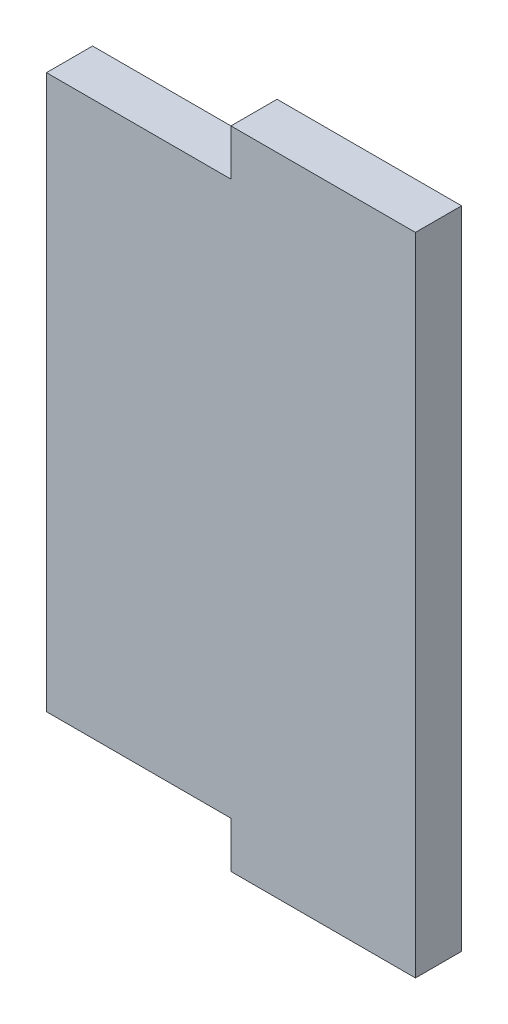
ISO-10303-21;
HEADER;
FILE_DESCRIPTION(('STEP AP214'),'2;1');
FILE_NAME('part.step','',(''),(''),'','','');
FILE_SCHEMA(('AUTOMOTIVE_DESIGN { 1 0 10303 214 1 1 1 1 }'));
ENDSEC;
DATA;
#1=APPLICATION_CONTEXT('core data for automotive mechanical design processes');
#2=APPLICATION_PROTOCOL_DEFINITION('international standard','automotive_design',2000,#1);
#3=PRODUCT_CONTEXT('',#1,'mechanical');
#4=PRODUCT('Part','Part','',(#3));
#5=PRODUCT_RELATED_PRODUCT_CATEGORY('part','',(#4));
#6=PRODUCT_DEFINITION_FORMATION('','',#4);
#7=PRODUCT_DEFINITION_CONTEXT('part definition',#1,'design');
#8=PRODUCT_DEFINITION('design','',#6,#7);
#9=PRODUCT_DEFINITION_SHAPE('','',#8);
#10=(LENGTH_UNIT() NAMED_UNIT(*) SI_UNIT(.MILLI.,.METRE.));
#11=(NAMED_UNIT(*) PLANE_ANGLE_UNIT() SI_UNIT($,.RADIAN.));
#12=(NAMED_UNIT(*) SI_UNIT($,.STERADIAN.) SOLID_ANGLE_UNIT());
#13=UNCERTAINTY_MEASURE_WITH_UNIT(LENGTH_MEASURE(1.E-05),#10,'distance_accuracy_value','');
#14=(GEOMETRIC_REPRESENTATION_CONTEXT(3) GLOBAL_UNCERTAINTY_ASSIGNED_CONTEXT((#13)) GLOBAL_UNIT_ASSIGNED_CONTEXT((#10,
#11,#12)) REPRESENTATION_CONTEXT('',''));
#15=CARTESIAN_POINT('',(0.,0.,0.));
#16=DIRECTION('',(0.,0.,1.));
#17=DIRECTION('',(1.,0.,0.));
#18=AXIS2_PLACEMENT_3D('',#15,#16,#17);
#19=CARTESIAN_POINT('',(136.525,0.,3.175));
#20=DIRECTION('',(0.,-1.,0.));
#21=DIRECTION('',(0.,0.,-1.));
#22=AXIS2_PLACEMENT_3D('',#19,#20,#21);
#23=PLANE('',#22);
#24=DIRECTION('',(-1.,0.,0.));
#25=VECTOR('',#24,1.);
#26=CARTESIAN_POINT('',(136.525,0.,0.));
#27=LINE('',#26,#25);
#28=CARTESIAN_POINT('',(136.525,0.,0.));
#29=VERTEX_POINT('',#28);
#30=CARTESIAN_POINT('',(123.825,0.,0.));
#31=VERTEX_POINT('',#30);
#32=EDGE_CURVE('E129',#29,#31,#27,.T.);
#33=ORIENTED_EDGE('',*,*,#32,.T.);
#34=DIRECTION('',(0.,0.,-1.));
#35=VECTOR('',#34,1.);
#36=CARTESIAN_POINT('',(123.825,0.,3.175));
#37=LINE('',#36,#35);
#38=CARTESIAN_POINT('',(123.825,0.,3.175));
#39=VERTEX_POINT('',#38);
#40=EDGE_CURVE('E11',#39,#31,#37,.T.);
#41=ORIENTED_EDGE('',*,*,#40,.F.);
#42=DIRECTION('',(-1.,0.,0.));
#43=VECTOR('',#42,1.);
#44=CARTESIAN_POINT('',(136.525,0.,3.175));
#45=LINE('',#44,#43);
#46=CARTESIAN_POINT('',(136.525,0.,3.175));
#47=VERTEX_POINT('',#46);
#48=EDGE_CURVE('E148',#47,#39,#45,.T.);
#49=ORIENTED_EDGE('',*,*,#48,.F.);
#50=DIRECTION('',(0.,0.,-1.));
#51=VECTOR('',#50,1.);
#52=CARTESIAN_POINT('',(136.525,0.,3.175));
#53=LINE('',#52,#51);
#54=EDGE_CURVE('E49',#47,#29,#53,.T.);
#55=ORIENTED_EDGE('',*,*,#54,.T.);
#56=EDGE_LOOP('',(#33,#41,#49,#55));
#57=FACE_BOUND('',#56,.T.);
#58=ADVANCED_FACE('F33',(#57),#23,.F.);
#59=CARTESIAN_POINT('',(123.825,0.,3.175));
#60=DIRECTION('',(1.,0.,0.));
#61=DIRECTION('',(0.,0.,-1.));
#62=AXIS2_PLACEMENT_3D('',#59,#60,#61);
#63=PLANE('',#62);
#64=DIRECTION('',(0.,-1.,0.));
#65=VECTOR('',#64,1.);
#66=CARTESIAN_POINT('',(123.825,0.,0.));
#67=LINE('',#66,#65);
#68=CARTESIAN_POINT('',(123.825,-3.175,0.));
#69=VERTEX_POINT('',#68);
#70=EDGE_CURVE('E131',#31,#69,#67,.T.);
#71=ORIENTED_EDGE('',*,*,#70,.T.);
#72=DIRECTION('',(0.,0.,-1.));
#73=VECTOR('',#72,1.);
#74=CARTESIAN_POINT('',(123.825,-3.175,3.175));
#75=LINE('',#74,#73);
#76=CARTESIAN_POINT('',(123.825,-3.175,3.175));
#77=VERTEX_POINT('',#76);
#78=EDGE_CURVE('E41',#77,#69,#75,.T.);
#79=ORIENTED_EDGE('',*,*,#78,.F.);
#80=DIRECTION('',(0.,-1.,0.));
#81=VECTOR('',#80,1.);
#82=CARTESIAN_POINT('',(123.825,0.,3.175));
#83=LINE('',#82,#81);
#84=EDGE_CURVE('E87',#39,#77,#83,.T.);
#85=ORIENTED_EDGE('',*,*,#84,.F.);
#86=ORIENTED_EDGE('',*,*,#40,.T.);
#87=EDGE_LOOP('',(#71,#79,#85,#86));
#88=FACE_BOUND('',#87,.T.);
#89=ADVANCED_FACE('F162',(#88),#63,.F.);
#90=CARTESIAN_POINT('',(111.125,-3.175,3.175));
#91=DIRECTION('',(0.,1.,0.));
#92=DIRECTION('',(0.,0.,1.));
#93=AXIS2_PLACEMENT_3D('',#90,#91,#92);
#94=PLANE('',#93);
#95=DIRECTION('',(1.,0.,0.));
#96=VECTOR('',#95,1.);
#97=CARTESIAN_POINT('',(111.125,-3.175,0.));
#98=LINE('',#97,#96);
#99=CARTESIAN_POINT('',(111.125,-3.175,0.));
#100=VERTEX_POINT('',#99);
#101=EDGE_CURVE('E134',#100,#69,#98,.T.);
#102=ORIENTED_EDGE('',*,*,#101,.F.);
#103=DIRECTION('',(0.,0.,-1.));
#104=VECTOR('',#103,1.);
#105=CARTESIAN_POINT('',(111.125,-3.175,3.175));
#106=LINE('',#105,#104);
#107=CARTESIAN_POINT('',(111.125,-3.175,3.175));
#108=VERTEX_POINT('',#107);
#109=EDGE_CURVE('E155',#108,#100,#106,.T.);
#110=ORIENTED_EDGE('',*,*,#109,.F.);
#111=DIRECTION('',(1.,0.,0.));
#112=VECTOR('',#111,1.);
#113=CARTESIAN_POINT('',(111.125,-3.175,3.175));
#114=LINE('',#113,#112);
#115=EDGE_CURVE('E161',#108,#77,#114,.T.);
#116=ORIENTED_EDGE('',*,*,#115,.T.);
#117=ORIENTED_EDGE('',*,*,#78,.T.);
#118=EDGE_LOOP('',(#102,#110,#116,#117));
#119=FACE_BOUND('',#118,.T.);
#120=ADVANCED_FACE('F159',(#119),#94,.T.);
#121=CARTESIAN_POINT('',(111.125,-3.175,3.175));
#122=DIRECTION('',(1.,0.,0.));
#123=DIRECTION('',(0.,0.,-1.));
#124=AXIS2_PLACEMENT_3D('',#121,#122,#123);
#125=PLANE('',#124);
#126=DIRECTION('',(0.,-1.,0.));
#127=VECTOR('',#126,1.);
#128=CARTESIAN_POINT('',(111.125,-3.175,0.));
#129=LINE('',#128,#127);
#130=CARTESIAN_POINT('',(111.125,-41.275,0.));
#131=VERTEX_POINT('',#130);
#132=EDGE_CURVE('E137',#100,#131,#129,.T.);
#133=ORIENTED_EDGE('',*,*,#132,.T.);
#134=DIRECTION('',(0.,0.,-1.));
#135=VECTOR('',#134,1.);
#136=CARTESIAN_POINT('',(111.125,-41.275,3.175));
#137=LINE('',#136,#135);
#138=CARTESIAN_POINT('',(111.125,-41.275,3.175));
#139=VERTEX_POINT('',#138);
#140=EDGE_CURVE('E152',#139,#131,#137,.T.);
#141=ORIENTED_EDGE('',*,*,#140,.F.);
#142=DIRECTION('',(0.,-1.,0.));
#143=VECTOR('',#142,1.);
#144=CARTESIAN_POINT('',(111.125,-3.175,3.175));
#145=LINE('',#144,#143);
#146=EDGE_CURVE('E174',#108,#139,#145,.T.);
#147=ORIENTED_EDGE('',*,*,#146,.F.);
#148=ORIENTED_EDGE('',*,*,#109,.T.);
#149=EDGE_LOOP('',(#133,#141,#147,#148));
#150=FACE_BOUND('',#149,.T.);
#151=ADVANCED_FACE('F170',(#150),#125,.F.);
#152=CARTESIAN_POINT('',(111.125,-41.275,3.175));
#153=DIRECTION('',(0.,1.,0.));
#154=DIRECTION('',(0.,0.,1.));
#155=AXIS2_PLACEMENT_3D('',#152,#153,#154);
#156=PLANE('',#155);
#157=DIRECTION('',(1.,0.,0.));
#158=VECTOR('',#157,1.);
#159=CARTESIAN_POINT('',(111.125,-41.275,0.));
#160=LINE('',#159,#158);
#161=CARTESIAN_POINT('',(123.825,-41.275,0.));
#162=VERTEX_POINT('',#161);
#163=EDGE_CURVE('E139',#131,#162,#160,.T.);
#164=ORIENTED_EDGE('',*,*,#163,.T.);
#165=DIRECTION('',(0.,0.,-1.));
#166=VECTOR('',#165,1.);
#167=CARTESIAN_POINT('',(123.825,-41.275,3.175));
#168=LINE('',#167,#166);
#169=CARTESIAN_POINT('',(123.825,-41.275,3.175));
#170=VERTEX_POINT('',#169);
#171=EDGE_CURVE('E112',#170,#162,#168,.T.);
#172=ORIENTED_EDGE('',*,*,#171,.F.);
#173=DIRECTION('',(1.,0.,0.));
#174=VECTOR('',#173,1.);
#175=CARTESIAN_POINT('',(111.125,-41.275,3.175));
#176=LINE('',#175,#174);
#177=EDGE_CURVE('E120',#139,#170,#176,.T.);
#178=ORIENTED_EDGE('',*,*,#177,.F.);
#179=ORIENTED_EDGE('',*,*,#140,.T.);
#180=EDGE_LOOP('',(#164,#172,#178,#179));
#181=FACE_BOUND('',#180,.T.);
#182=ADVANCED_FACE('F173',(#181),#156,.F.);
#183=CARTESIAN_POINT('',(123.825,-44.45,3.175));
#184=DIRECTION('',(-1.,0.,0.));
#185=DIRECTION('',(0.,0.,1.));
#186=AXIS2_PLACEMENT_3D('',#183,#184,#185);
#187=PLANE('',#186);
#188=DIRECTION('',(0.,1.,0.));
#189=VECTOR('',#188,1.);
#190=CARTESIAN_POINT('',(123.825,-44.45,0.));
#191=LINE('',#190,#189);
#192=CARTESIAN_POINT('',(123.825,-44.45,0.));
#193=VERTEX_POINT('',#192);
#194=EDGE_CURVE('E108',#193,#162,#191,.T.);
#195=ORIENTED_EDGE('',*,*,#194,.F.);
#196=DIRECTION('',(0.,0.,-1.));
#197=VECTOR('',#196,1.);
#198=CARTESIAN_POINT('',(123.825,-44.45,3.175));
#199=LINE('',#198,#197);
#200=CARTESIAN_POINT('',(123.825,-44.45,3.175));
#201=VERTEX_POINT('',#200);
#202=EDGE_CURVE('E103',#201,#193,#199,.T.);
#203=ORIENTED_EDGE('',*,*,#202,.F.);
#204=DIRECTION('',(0.,1.,0.));
#205=VECTOR('',#204,1.);
#206=CARTESIAN_POINT('',(123.825,-44.45,3.175));
#207=LINE('',#206,#205);
#208=EDGE_CURVE('E106',#201,#170,#207,.T.);
#209=ORIENTED_EDGE('',*,*,#208,.T.);
#210=ORIENTED_EDGE('',*,*,#171,.T.);
#211=EDGE_LOOP('',(#195,#203,#209,#210));
#212=FACE_BOUND('',#211,.T.);
#213=ADVANCED_FACE('F105',(#212),#187,.T.);
#214=CARTESIAN_POINT('',(136.525,-44.45,3.175));
#215=DIRECTION('',(0.,-1.,0.));
#216=DIRECTION('',(0.,0.,-1.));
#217=AXIS2_PLACEMENT_3D('',#214,#215,#216);
#218=PLANE('',#217);
#219=DIRECTION('',(-1.,0.,0.));
#220=VECTOR('',#219,1.);
#221=CARTESIAN_POINT('',(136.525,-44.45,0.));
#222=LINE('',#221,#220);
#223=CARTESIAN_POINT('',(136.525,-44.45,0.));
#224=VERTEX_POINT('',#223);
#225=EDGE_CURVE('E143',#224,#193,#222,.T.);
#226=ORIENTED_EDGE('',*,*,#225,.F.);
#227=DIRECTION('',(0.,0.,-1.));
#228=VECTOR('',#227,1.);
#229=CARTESIAN_POINT('',(136.525,-44.45,3.175));
#230=LINE('',#229,#228);
#231=CARTESIAN_POINT('',(136.525,-44.45,3.175));
#232=VERTEX_POINT('',#231);
#233=EDGE_CURVE('E75',#232,#224,#230,.T.);
#234=ORIENTED_EDGE('',*,*,#233,.F.);
#235=DIRECTION('',(-1.,0.,0.));
#236=VECTOR('',#235,1.);
#237=CARTESIAN_POINT('',(136.525,-44.45,3.175));
#238=LINE('',#237,#236);
#239=EDGE_CURVE('E118',#232,#201,#238,.T.);
#240=ORIENTED_EDGE('',*,*,#239,.T.);
#241=ORIENTED_EDGE('',*,*,#202,.T.);
#242=EDGE_LOOP('',(#226,#234,#240,#241));
#243=FACE_BOUND('',#242,.T.);
#244=ADVANCED_FACE('F123',(#243),#218,.T.);
#245=CARTESIAN_POINT('',(136.525,0.,3.175));
#246=DIRECTION('',(1.,0.,0.));
#247=DIRECTION('',(0.,0.,-1.));
#248=AXIS2_PLACEMENT_3D('',#245,#246,#247);
#249=PLANE('',#248);
#250=DIRECTION('',(0.,-1.,0.));
#251=VECTOR('',#250,1.);
#252=CARTESIAN_POINT('',(136.525,0.,0.));
#253=LINE('',#252,#251);
#254=EDGE_CURVE('E145',#29,#224,#253,.T.);
#255=ORIENTED_EDGE('',*,*,#254,.F.);
#256=ORIENTED_EDGE('',*,*,#54,.F.);
#257=DIRECTION('',(0.,-1.,0.));
#258=VECTOR('',#257,1.);
#259=CARTESIAN_POINT('',(136.525,0.,3.175));
#260=LINE('',#259,#258);
#261=EDGE_CURVE('E124',#47,#232,#260,.T.);
#262=ORIENTED_EDGE('',*,*,#261,.T.);
#263=ORIENTED_EDGE('',*,*,#233,.T.);
#264=EDGE_LOOP('',(#255,#256,#262,#263));
#265=FACE_BOUND('',#264,.T.);
#266=ADVANCED_FACE('F179',(#265),#249,.T.);
#267=CARTESIAN_POINT('',(0.,0.,3.175));
#268=DIRECTION('',(0.,0.,1.));
#269=DIRECTION('',(1.,0.,0.));
#270=AXIS2_PLACEMENT_3D('',#267,#268,#269);
#271=PLANE('',#270);
#272=ORIENTED_EDGE('',*,*,#48,.T.);
#273=ORIENTED_EDGE('',*,*,#84,.T.);
#274=ORIENTED_EDGE('',*,*,#115,.F.);
#275=ORIENTED_EDGE('',*,*,#146,.T.);
#276=ORIENTED_EDGE('',*,*,#177,.T.);
#277=ORIENTED_EDGE('',*,*,#208,.F.);
#278=ORIENTED_EDGE('',*,*,#239,.F.);
#279=ORIENTED_EDGE('',*,*,#261,.F.);
#280=EDGE_LOOP('',(#272,#273,#274,#275,#276,#277,#278,#279));
#281=FACE_BOUND('',#280,.T.);
#282=ADVANCED_FACE('F116',(#281),#271,.T.);
#283=CARTESIAN_POINT('',(0.,0.,0.));
#284=DIRECTION('',(0.,0.,1.));
#285=DIRECTION('',(1.,0.,0.));
#286=AXIS2_PLACEMENT_3D('',#283,#284,#285);
#287=PLANE('',#286);
#288=ORIENTED_EDGE('',*,*,#32,.F.);
#289=ORIENTED_EDGE('',*,*,#254,.T.);
#290=ORIENTED_EDGE('',*,*,#225,.T.);
#291=ORIENTED_EDGE('',*,*,#194,.T.);
#292=ORIENTED_EDGE('',*,*,#163,.F.);
#293=ORIENTED_EDGE('',*,*,#132,.F.);
#294=ORIENTED_EDGE('',*,*,#101,.T.);
#295=ORIENTED_EDGE('',*,*,#70,.F.);
#296=EDGE_LOOP('',(#288,#289,#290,#291,#292,#293,#294,#295));
#297=FACE_BOUND('',#296,.T.);
#298=ADVANCED_FACE('F166',(#297),#287,.F.);
#299=CLOSED_SHELL('',(#58,#89,#120,#151,#182,#213,#244,#266,#282,#298));
#300=MANIFOLD_SOLID_BREP('B2',#299);
#301=ADVANCED_BREP_SHAPE_REPRESENTATION('',(#18,#300),#14);
#302=SHAPE_DEFINITION_REPRESENTATION(#9,#301);
ENDSEC;
END-ISO-10303-21;
